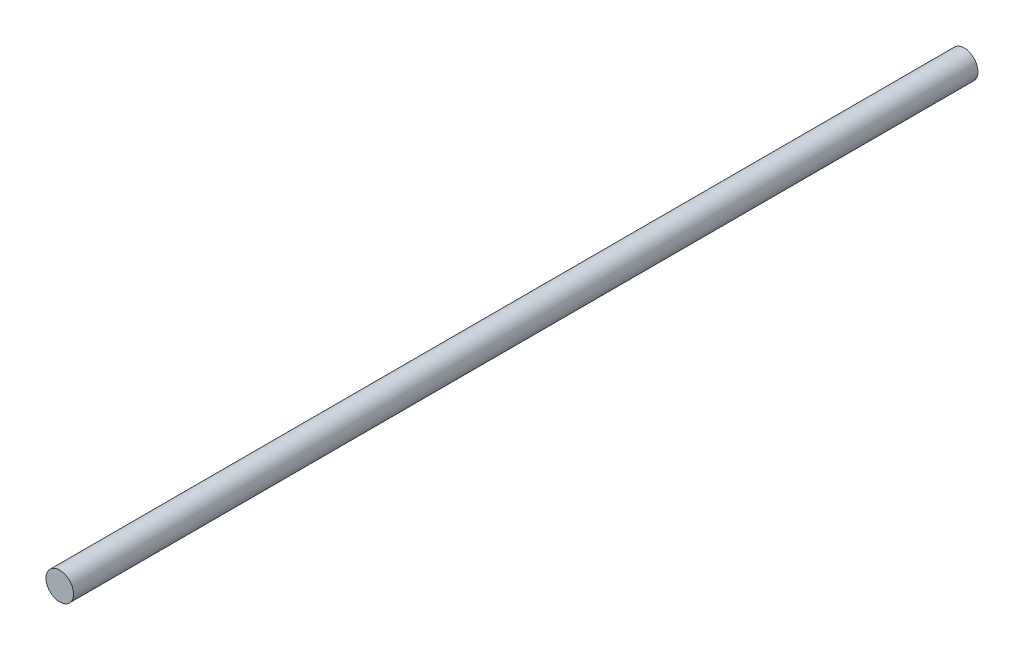
ISO-10303-21;
HEADER;
FILE_DESCRIPTION(('STEP AP214'),'2;1');
FILE_NAME('part.step','',(''),(''),'','','');
FILE_SCHEMA(('AUTOMOTIVE_DESIGN { 1 0 10303 214 1 1 1 1 }'));
ENDSEC;
DATA;
#1=APPLICATION_CONTEXT('core data for automotive mechanical design processes');
#2=APPLICATION_PROTOCOL_DEFINITION('international standard','automotive_design',2000,#1);
#3=PRODUCT_CONTEXT('',#1,'mechanical');
#4=PRODUCT('Part','Part','',(#3));
#5=PRODUCT_RELATED_PRODUCT_CATEGORY('part','',(#4));
#6=PRODUCT_DEFINITION_FORMATION('','',#4);
#7=PRODUCT_DEFINITION_CONTEXT('part definition',#1,'design');
#8=PRODUCT_DEFINITION('design','',#6,#7);
#9=PRODUCT_DEFINITION_SHAPE('','',#8);
#10=(LENGTH_UNIT() NAMED_UNIT(*) SI_UNIT(.MILLI.,.METRE.));
#11=(NAMED_UNIT(*) PLANE_ANGLE_UNIT() SI_UNIT($,.RADIAN.));
#12=(NAMED_UNIT(*) SI_UNIT($,.STERADIAN.) SOLID_ANGLE_UNIT());
#13=UNCERTAINTY_MEASURE_WITH_UNIT(LENGTH_MEASURE(1.E-05),#10,'distance_accuracy_value','');
#14=(GEOMETRIC_REPRESENTATION_CONTEXT(3) GLOBAL_UNCERTAINTY_ASSIGNED_CONTEXT((#13)) GLOBAL_UNIT_ASSIGNED_CONTEXT((#10,
#11,#12)) REPRESENTATION_CONTEXT('',''));
#15=CARTESIAN_POINT('',(0.,0.,0.));
#16=DIRECTION('',(0.,0.,1.));
#17=DIRECTION('',(1.,0.,0.));
#18=AXIS2_PLACEMENT_3D('',#15,#16,#17);
#19=CARTESIAN_POINT('',(0.,0.,196.936087348155));
#20=DIRECTION('',(0.,0.,-1.));
#21=DIRECTION('',(-1.,0.,0.));
#22=AXIS2_PLACEMENT_3D('',#19,#20,#21);
#23=CYLINDRICAL_SURFACE('',#22,3.);
#24=CARTESIAN_POINT('',(0.,0.,196.936087348155));
#25=DIRECTION('',(0.,0.,1.));
#26=DIRECTION('',(1.,0.,0.));
#27=AXIS2_PLACEMENT_3D('',#24,#25,#26);
#28=CIRCLE('',#27,3.);
#29=CARTESIAN_POINT('',(3.,0.,196.936087348155));
#30=VERTEX_POINT('',#29);
#31=EDGE_CURVE('E10',#30,#30,#28,.T.);
#32=ORIENTED_EDGE('',*,*,#31,.F.);
#33=EDGE_LOOP('',(#32));
#34=FACE_BOUND('',#33,.T.);
#35=CARTESIAN_POINT('',(0.,0.,0.));
#36=DIRECTION('',(0.,0.,1.));
#37=DIRECTION('',(1.,0.,0.));
#38=AXIS2_PLACEMENT_3D('',#35,#36,#37);
#39=CIRCLE('',#38,3.);
#40=CARTESIAN_POINT('',(3.,0.,0.));
#41=VERTEX_POINT('',#40);
#42=EDGE_CURVE('E40',#41,#41,#39,.T.);
#43=ORIENTED_EDGE('',*,*,#42,.T.);
#44=EDGE_LOOP('',(#43));
#45=FACE_BOUND('',#44,.T.);
#46=ADVANCED_FACE('F37',(#34,#45),#23,.T.);
#47=CARTESIAN_POINT('',(0.,0.,196.936087348155));
#48=DIRECTION('',(0.,0.,1.));
#49=DIRECTION('',(1.,0.,0.));
#50=AXIS2_PLACEMENT_3D('',#47,#48,#49);
#51=PLANE('',#50);
#52=ORIENTED_EDGE('',*,*,#31,.T.);
#53=EDGE_LOOP('',(#52));
#54=FACE_BOUND('',#53,.T.);
#55=ADVANCED_FACE('F52',(#54),#51,.T.);
#56=CARTESIAN_POINT('',(0.,0.,0.));
#57=DIRECTION('',(0.,0.,1.));
#58=DIRECTION('',(1.,0.,0.));
#59=AXIS2_PLACEMENT_3D('',#56,#57,#58);
#60=PLANE('',#59);
#61=ORIENTED_EDGE('',*,*,#42,.F.);
#62=EDGE_LOOP('',(#61));
#63=FACE_BOUND('',#62,.T.);
#64=ADVANCED_FACE('F50',(#63),#60,.F.);
#65=CLOSED_SHELL('',(#46,#55,#64));
#66=MANIFOLD_SOLID_BREP('B2',#65);
#67=ADVANCED_BREP_SHAPE_REPRESENTATION('',(#18,#66),#14);
#68=SHAPE_DEFINITION_REPRESENTATION(#9,#67);
ENDSEC;
END-ISO-10303-21;
